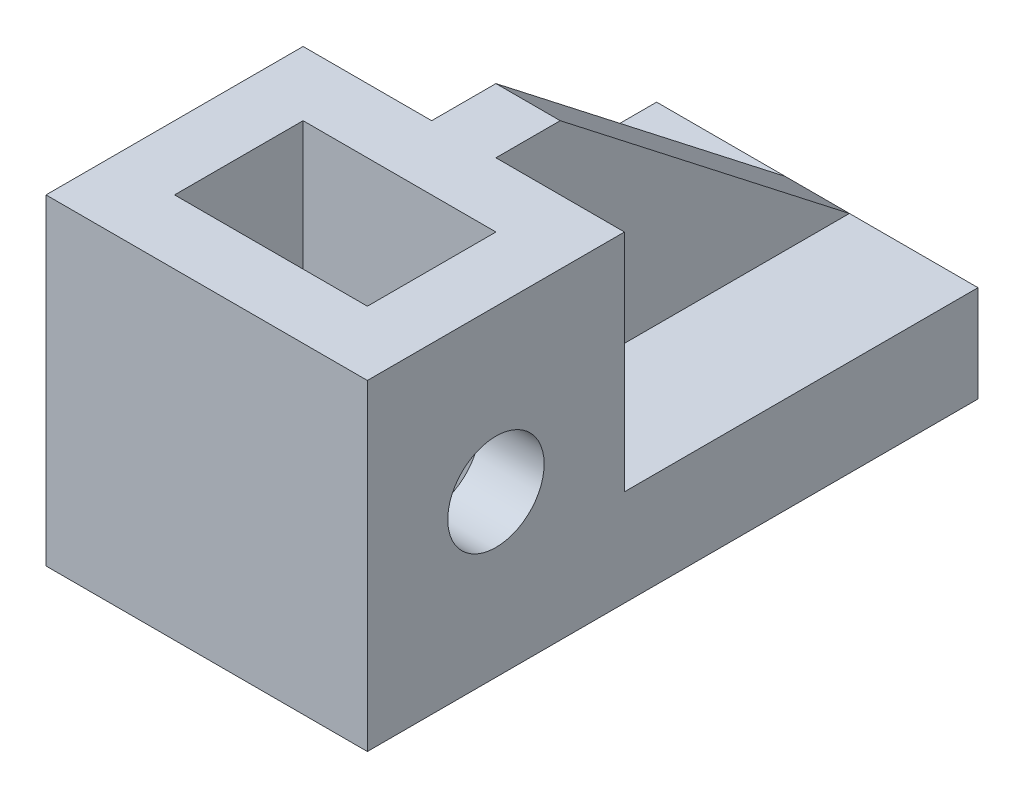
ISO-10303-21;
HEADER;
FILE_DESCRIPTION(('STEP AP214'),'2;1');
FILE_NAME('part.step','',(''),(''),'','','');
FILE_SCHEMA(('AUTOMOTIVE_DESIGN { 1 0 10303 214 1 1 1 1 }'));
ENDSEC;
DATA;
#1=APPLICATION_CONTEXT('core data for automotive mechanical design processes');
#2=APPLICATION_PROTOCOL_DEFINITION('international standard','automotive_design',2000,#1);
#3=PRODUCT_CONTEXT('',#1,'mechanical');
#4=PRODUCT('Part','Part','',(#3));
#5=PRODUCT_RELATED_PRODUCT_CATEGORY('part','',(#4));
#6=PRODUCT_DEFINITION_FORMATION('','',#4);
#7=PRODUCT_DEFINITION_CONTEXT('part definition',#1,'design');
#8=PRODUCT_DEFINITION('design','',#6,#7);
#9=PRODUCT_DEFINITION_SHAPE('','',#8);
#10=(LENGTH_UNIT() NAMED_UNIT(*) SI_UNIT(.MILLI.,.METRE.));
#11=(NAMED_UNIT(*) PLANE_ANGLE_UNIT() SI_UNIT($,.RADIAN.));
#12=(NAMED_UNIT(*) SI_UNIT($,.STERADIAN.) SOLID_ANGLE_UNIT());
#13=UNCERTAINTY_MEASURE_WITH_UNIT(LENGTH_MEASURE(1.E-05),#10,'distance_accuracy_value','');
#14=(GEOMETRIC_REPRESENTATION_CONTEXT(3) GLOBAL_UNCERTAINTY_ASSIGNED_CONTEXT((#13)) GLOBAL_UNIT_ASSIGNED_CONTEXT((#10,
#11,#12)) REPRESENTATION_CONTEXT('',''));
#15=CARTESIAN_POINT('',(0.,0.,0.));
#16=DIRECTION('',(0.,0.,1.));
#17=DIRECTION('',(1.,0.,0.));
#18=AXIS2_PLACEMENT_3D('',#15,#16,#17);
#19=CARTESIAN_POINT('',(-25.,15.,-95.));
#20=DIRECTION('',(0.,1.,0.));
#21=DIRECTION('',(0.,0.,1.));
#22=AXIS2_PLACEMENT_3D('',#19,#20,#21);
#23=PLANE('',#22);
#24=DIRECTION('',(0.,0.,1.));
#25=VECTOR('',#24,1.);
#26=CARTESIAN_POINT('',(-5.,15.,-95.));
#27=LINE('',#26,#25);
#28=CARTESIAN_POINT('',(-5.,15.,-95.));
#29=VERTEX_POINT('',#28);
#30=CARTESIAN_POINT('',(-5.,15.,-40.));
#31=VERTEX_POINT('',#30);
#32=EDGE_CURVE('E11',#29,#31,#27,.T.);
#33=ORIENTED_EDGE('',*,*,#32,.F.);
#34=DIRECTION('',(1.,0.,0.));
#35=VECTOR('',#34,1.);
#36=CARTESIAN_POINT('',(-25.,15.,-95.));
#37=LINE('',#36,#35);
#38=CARTESIAN_POINT('',(-25.,15.,-95.));
#39=VERTEX_POINT('',#38);
#40=EDGE_CURVE('E164',#39,#29,#37,.T.);
#41=ORIENTED_EDGE('',*,*,#40,.F.);
#42=DIRECTION('',(0.,0.,1.));
#43=VECTOR('',#42,1.);
#44=CARTESIAN_POINT('',(-25.,15.,-95.));
#45=LINE('',#44,#43);
#46=CARTESIAN_POINT('',(-25.,15.,-40.));
#47=VERTEX_POINT('',#46);
#48=EDGE_CURVE('E226',#39,#47,#45,.T.);
#49=ORIENTED_EDGE('',*,*,#48,.T.);
#50=DIRECTION('',(1.,0.,0.));
#51=VECTOR('',#50,1.);
#52=CARTESIAN_POINT('',(-25.,15.,-40.));
#53=LINE('',#52,#51);
#54=EDGE_CURVE('E253',#47,#31,#53,.T.);
#55=ORIENTED_EDGE('',*,*,#54,.T.);
#56=EDGE_LOOP('',(#33,#41,#49,#55));
#57=FACE_BOUND('',#56,.T.);
#58=ADVANCED_FACE('F37',(#57),#23,.T.);
#59=CARTESIAN_POINT('',(-25.,50.,-40.));
#60=DIRECTION('',(0.,0.,-1.));
#61=DIRECTION('',(0.,1.,0.));
#62=AXIS2_PLACEMENT_3D('',#59,#60,#61);
#63=PLANE('',#62);
#64=DIRECTION('',(0.,1.,0.));
#65=VECTOR('',#64,1.);
#66=CARTESIAN_POINT('',(-5.,9.99999999999998,-40.));
#67=LINE('',#66,#65);
#68=CARTESIAN_POINT('',(-5.,50.,-40.));
#69=VERTEX_POINT('',#68);
#70=EDGE_CURVE('E179',#31,#69,#67,.T.);
#71=ORIENTED_EDGE('',*,*,#70,.F.);
#72=ORIENTED_EDGE('',*,*,#54,.F.);
#73=DIRECTION('',(0.,1.,0.));
#74=VECTOR('',#73,1.);
#75=CARTESIAN_POINT('',(-25.,50.,-40.));
#76=LINE('',#75,#74);
#77=CARTESIAN_POINT('',(-25.,50.,-40.));
#78=VERTEX_POINT('',#77);
#79=EDGE_CURVE('E229',#47,#78,#76,.T.);
#80=ORIENTED_EDGE('',*,*,#79,.T.);
#81=DIRECTION('',(1.,0.,0.));
#82=VECTOR('',#81,1.);
#83=CARTESIAN_POINT('',(-25.,50.,-40.));
#84=LINE('',#83,#82);
#85=EDGE_CURVE('E60',#78,#69,#84,.T.);
#86=ORIENTED_EDGE('',*,*,#85,.T.);
#87=EDGE_LOOP('',(#71,#72,#80,#86));
#88=FACE_BOUND('',#87,.T.);
#89=ADVANCED_FACE('F309',(#88),#63,.T.);
#90=CARTESIAN_POINT('',(-25.,50.,0.));
#91=DIRECTION('',(0.,1.,0.));
#92=DIRECTION('',(0.,0.,1.));
#93=AXIS2_PLACEMENT_3D('',#90,#91,#92);
#94=PLANE('',#93);
#95=DIRECTION('',(-1.,0.,0.));
#96=VECTOR('',#95,1.);
#97=CARTESIAN_POINT('',(-25.,50.,-10.));
#98=LINE('',#97,#96);
#99=CARTESIAN_POINT('',(15.,50.,-10.));
#100=VERTEX_POINT('',#99);
#101=CARTESIAN_POINT('',(-15.,50.,-10.));
#102=VERTEX_POINT('',#101);
#103=EDGE_CURVE('E250',#100,#102,#98,.T.);
#104=ORIENTED_EDGE('',*,*,#103,.T.);
#105=DIRECTION('',(0.,0.,-1.));
#106=VECTOR('',#105,1.);
#107=CARTESIAN_POINT('',(-15.,50.,0.));
#108=LINE('',#107,#106);
#109=CARTESIAN_POINT('',(-15.,50.,-30.));
#110=VERTEX_POINT('',#109);
#111=EDGE_CURVE('E203',#102,#110,#108,.T.);
#112=ORIENTED_EDGE('',*,*,#111,.T.);
#113=DIRECTION('',(1.,0.,0.));
#114=VECTOR('',#113,1.);
#115=CARTESIAN_POINT('',(-25.,50.,-30.));
#116=LINE('',#115,#114);
#117=CARTESIAN_POINT('',(15.,50.,-30.));
#118=VERTEX_POINT('',#117);
#119=EDGE_CURVE('E144',#110,#118,#116,.T.);
#120=ORIENTED_EDGE('',*,*,#119,.T.);
#121=DIRECTION('',(0.,0.,1.));
#122=VECTOR('',#121,1.);
#123=CARTESIAN_POINT('',(15.,50.,0.));
#124=LINE('',#123,#122);
#125=EDGE_CURVE('E207',#118,#100,#124,.T.);
#126=ORIENTED_EDGE('',*,*,#125,.T.);
#127=EDGE_LOOP('',(#104,#112,#120,#126));
#128=FACE_BOUND('',#127,.T.);
#129=DIRECTION('',(1.,0.,0.));
#130=VECTOR('',#129,1.);
#131=CARTESIAN_POINT('',(-25.,50.,0.));
#132=LINE('',#131,#130);
#133=CARTESIAN_POINT('',(-25.,50.,0.));
#134=VERTEX_POINT('',#133);
#135=CARTESIAN_POINT('',(25.,50.,0.));
#136=VERTEX_POINT('',#135);
#137=EDGE_CURVE('E248',#134,#136,#132,.T.);
#138=ORIENTED_EDGE('',*,*,#137,.T.);
#139=DIRECTION('',(0.,0.,1.));
#140=VECTOR('',#139,1.);
#141=CARTESIAN_POINT('',(25.,50.,0.));
#142=LINE('',#141,#140);
#143=CARTESIAN_POINT('',(25.,50.,-40.));
#144=VERTEX_POINT('',#143);
#145=EDGE_CURVE('E221',#144,#136,#142,.T.);
#146=ORIENTED_EDGE('',*,*,#145,.F.);
#147=CARTESIAN_POINT('',(5.,50.,-40.));
#148=VERTEX_POINT('',#147);
#149=EDGE_CURVE('E252',#148,#144,#84,.T.);
#150=ORIENTED_EDGE('',*,*,#149,.F.);
#151=DIRECTION('',(0.,0.,-1.));
#152=VECTOR('',#151,1.);
#153=CARTESIAN_POINT('',(5.,50.,-50.));
#154=LINE('',#153,#152);
#155=CARTESIAN_POINT('',(5.,50.,-50.));
#156=VERTEX_POINT('',#155);
#157=EDGE_CURVE('E170',#148,#156,#154,.T.);
#158=ORIENTED_EDGE('',*,*,#157,.T.);
#159=DIRECTION('',(-1.,0.,0.));
#160=VECTOR('',#159,1.);
#161=CARTESIAN_POINT('',(-5.,50.,-50.));
#162=LINE('',#161,#160);
#163=CARTESIAN_POINT('',(-5.,50.,-50.));
#164=VERTEX_POINT('',#163);
#165=EDGE_CURVE('E152',#156,#164,#162,.T.);
#166=ORIENTED_EDGE('',*,*,#165,.T.);
#167=DIRECTION('',(0.,0.,1.));
#168=VECTOR('',#167,1.);
#169=CARTESIAN_POINT('',(-5.,50.,-40.));
#170=LINE('',#169,#168);
#171=EDGE_CURVE('E176',#164,#69,#170,.T.);
#172=ORIENTED_EDGE('',*,*,#171,.T.);
#173=ORIENTED_EDGE('',*,*,#85,.F.);
#174=DIRECTION('',(0.,0.,1.));
#175=VECTOR('',#174,1.);
#176=CARTESIAN_POINT('',(-25.,50.,0.));
#177=LINE('',#176,#175);
#178=EDGE_CURVE('E231',#78,#134,#177,.T.);
#179=ORIENTED_EDGE('',*,*,#178,.T.);
#180=EDGE_LOOP('',(#138,#146,#150,#158,#166,#172,#173,#179));
#181=FACE_BOUND('',#180,.T.);
#182=ADVANCED_FACE('F266',(#128,#181),#94,.T.);
#183=CARTESIAN_POINT('',(-25.,25.,-20.));
#184=DIRECTION('',(1.,0.,0.));
#185=DIRECTION('',(0.,0.,-1.));
#186=AXIS2_PLACEMENT_3D('',#183,#184,#185);
#187=CYLINDRICAL_SURFACE('',#186,7.5);
#188=CARTESIAN_POINT('',(25.,25.,-20.));
#189=DIRECTION('',(1.,0.,0.));
#190=DIRECTION('',(0.,0.,-1.));
#191=AXIS2_PLACEMENT_3D('',#188,#189,#190);
#192=CIRCLE('',#191,7.5);
#193=CARTESIAN_POINT('',(25.,25.,-27.5));
#194=VERTEX_POINT('',#193);
#195=EDGE_CURVE('E210',#194,#194,#192,.T.);
#196=ORIENTED_EDGE('',*,*,#195,.T.);
#197=EDGE_LOOP('',(#196));
#198=FACE_BOUND('',#197,.T.);
#199=CARTESIAN_POINT('',(15.,25.,-20.));
#200=DIRECTION('',(-1.,0.,0.));
#201=DIRECTION('',(0.,0.,1.));
#202=AXIS2_PLACEMENT_3D('',#199,#200,#201);
#203=CIRCLE('',#202,7.5);
#204=CARTESIAN_POINT('',(15.,25.,-12.5));
#205=VERTEX_POINT('',#204);
#206=EDGE_CURVE('E206',#205,#205,#203,.F.);
#207=ORIENTED_EDGE('',*,*,#206,.F.);
#208=EDGE_LOOP('',(#207));
#209=FACE_BOUND('',#208,.T.);
#210=ADVANCED_FACE('F295',(#198,#209),#187,.F.);
#211=CARTESIAN_POINT('',(-25.,25.,-20.));
#212=DIRECTION('',(1.,0.,0.));
#213=DIRECTION('',(0.,0.,-1.));
#214=AXIS2_PLACEMENT_3D('',#211,#212,#213);
#215=CIRCLE('',#214,7.5);
#216=CARTESIAN_POINT('',(-25.,25.,-27.5));
#217=VERTEX_POINT('',#216);
#218=EDGE_CURVE('E211',#217,#217,#215,.T.);
#219=ORIENTED_EDGE('',*,*,#218,.F.);
#220=EDGE_LOOP('',(#219));
#221=FACE_BOUND('',#220,.T.);
#222=CARTESIAN_POINT('',(-15.,25.,-20.));
#223=DIRECTION('',(1.,0.,0.));
#224=DIRECTION('',(0.,0.,-1.));
#225=AXIS2_PLACEMENT_3D('',#222,#223,#224);
#226=CIRCLE('',#225,7.5);
#227=CARTESIAN_POINT('',(-15.,25.,-27.5));
#228=VERTEX_POINT('',#227);
#229=EDGE_CURVE('E202',#228,#228,#226,.F.);
#230=ORIENTED_EDGE('',*,*,#229,.F.);
#231=EDGE_LOOP('',(#230));
#232=FACE_BOUND('',#231,.T.);
#233=ADVANCED_FACE('F293',(#221,#232),#187,.F.);
#234=CARTESIAN_POINT('',(-25.,50.,0.));
#235=DIRECTION('',(0.,0.,1.));
#236=DIRECTION('',(1.,0.,0.));
#237=AXIS2_PLACEMENT_3D('',#234,#235,#236);
#238=PLANE('',#237);
#239=DIRECTION('',(0.,-1.,0.));
#240=VECTOR('',#239,1.);
#241=CARTESIAN_POINT('',(25.,50.,0.));
#242=LINE('',#241,#240);
#243=CARTESIAN_POINT('',(25.,0.,0.));
#244=VERTEX_POINT('',#243);
#245=EDGE_CURVE('E214',#136,#244,#242,.T.);
#246=ORIENTED_EDGE('',*,*,#245,.F.);
#247=ORIENTED_EDGE('',*,*,#137,.F.);
#248=DIRECTION('',(0.,-1.,0.));
#249=VECTOR('',#248,1.);
#250=CARTESIAN_POINT('',(-25.,50.,0.));
#251=LINE('',#250,#249);
#252=CARTESIAN_POINT('',(-25.,0.,0.));
#253=VERTEX_POINT('',#252);
#254=EDGE_CURVE('E217',#134,#253,#251,.T.);
#255=ORIENTED_EDGE('',*,*,#254,.T.);
#256=DIRECTION('',(1.,0.,0.));
#257=VECTOR('',#256,1.);
#258=CARTESIAN_POINT('',(-25.,0.,0.));
#259=LINE('',#258,#257);
#260=EDGE_CURVE('E234',#253,#244,#259,.T.);
#261=ORIENTED_EDGE('',*,*,#260,.T.);
#262=EDGE_LOOP('',(#246,#247,#255,#261));
#263=FACE_BOUND('',#262,.T.);
#264=ADVANCED_FACE('F39',(#263),#238,.T.);
#265=DIRECTION('',(0.,1.,0.));
#266=VECTOR('',#265,1.);
#267=CARTESIAN_POINT('',(5.,9.99999999999998,-40.));
#268=LINE('',#267,#266);
#269=CARTESIAN_POINT('',(5.,15.,-40.));
#270=VERTEX_POINT('',#269);
#271=EDGE_CURVE('E52',#270,#148,#268,.T.);
#272=ORIENTED_EDGE('',*,*,#271,.T.);
#273=ORIENTED_EDGE('',*,*,#149,.T.);
#274=DIRECTION('',(0.,1.,0.));
#275=VECTOR('',#274,1.);
#276=CARTESIAN_POINT('',(25.,50.,-40.));
#277=LINE('',#276,#275);
#278=CARTESIAN_POINT('',(25.,15.,-40.));
#279=VERTEX_POINT('',#278);
#280=EDGE_CURVE('E243',#279,#144,#277,.T.);
#281=ORIENTED_EDGE('',*,*,#280,.F.);
#282=EDGE_CURVE('E255',#270,#279,#53,.T.);
#283=ORIENTED_EDGE('',*,*,#282,.F.);
#284=EDGE_LOOP('',(#272,#273,#281,#283));
#285=FACE_BOUND('',#284,.T.);
#286=ADVANCED_FACE('F302',(#285),#63,.T.);
#287=CARTESIAN_POINT('',(5.,15.,-95.));
#288=VERTEX_POINT('',#287);
#289=CARTESIAN_POINT('',(25.,15.,-95.));
#290=VERTEX_POINT('',#289);
#291=EDGE_CURVE('E157',#288,#290,#37,.T.);
#292=ORIENTED_EDGE('',*,*,#291,.F.);
#293=DIRECTION('',(0.,0.,-1.));
#294=VECTOR('',#293,1.);
#295=CARTESIAN_POINT('',(5.,15.,-95.));
#296=LINE('',#295,#294);
#297=EDGE_CURVE('E45',#270,#288,#296,.T.);
#298=ORIENTED_EDGE('',*,*,#297,.F.);
#299=ORIENTED_EDGE('',*,*,#282,.T.);
#300=DIRECTION('',(0.,0.,1.));
#301=VECTOR('',#300,1.);
#302=CARTESIAN_POINT('',(25.,15.,-95.));
#303=LINE('',#302,#301);
#304=EDGE_CURVE('E160',#290,#279,#303,.T.);
#305=ORIENTED_EDGE('',*,*,#304,.F.);
#306=EDGE_LOOP('',(#292,#298,#299,#305));
#307=FACE_BOUND('',#306,.T.);
#308=ADVANCED_FACE('F158',(#307),#23,.T.);
#309=CARTESIAN_POINT('',(-25.,0.,-95.));
#310=DIRECTION('',(0.,0.,-1.));
#311=DIRECTION('',(-1.,0.,0.));
#312=AXIS2_PLACEMENT_3D('',#309,#310,#311);
#313=PLANE('',#312);
#314=DIRECTION('',(0.,1.,0.));
#315=VECTOR('',#314,1.);
#316=CARTESIAN_POINT('',(25.,0.,-95.));
#317=LINE('',#316,#315);
#318=CARTESIAN_POINT('',(25.,0.,-95.));
#319=VERTEX_POINT('',#318);
#320=EDGE_CURVE('E240',#319,#290,#317,.T.);
#321=ORIENTED_EDGE('',*,*,#320,.F.);
#322=DIRECTION('',(1.,0.,0.));
#323=VECTOR('',#322,1.);
#324=CARTESIAN_POINT('',(-25.,0.,-95.));
#325=LINE('',#324,#323);
#326=CARTESIAN_POINT('',(-25.,0.,-95.));
#327=VERTEX_POINT('',#326);
#328=EDGE_CURVE('E165',#327,#319,#325,.T.);
#329=ORIENTED_EDGE('',*,*,#328,.F.);
#330=DIRECTION('',(0.,1.,0.));
#331=VECTOR('',#330,1.);
#332=CARTESIAN_POINT('',(-25.,0.,-95.));
#333=LINE('',#332,#331);
#334=EDGE_CURVE('E224',#327,#39,#333,.T.);
#335=ORIENTED_EDGE('',*,*,#334,.T.);
#336=ORIENTED_EDGE('',*,*,#40,.T.);
#337=DIRECTION('',(-1.,0.,0.));
#338=VECTOR('',#337,1.);
#339=CARTESIAN_POINT('',(-25.,15.,-95.));
#340=LINE('',#339,#338);
#341=EDGE_CURVE('E149',#29,#288,#340,.F.);
#342=ORIENTED_EDGE('',*,*,#341,.T.);
#343=ORIENTED_EDGE('',*,*,#291,.T.);
#344=EDGE_LOOP('',(#321,#329,#335,#336,#342,#343));
#345=FACE_BOUND('',#344,.T.);
#346=ADVANCED_FACE('F168',(#345),#313,.T.);
#347=CARTESIAN_POINT('',(-25.,0.,0.));
#348=DIRECTION('',(0.,-1.,0.));
#349=DIRECTION('',(0.,0.,-1.));
#350=AXIS2_PLACEMENT_3D('',#347,#348,#349);
#351=PLANE('',#350);
#352=DIRECTION('',(0.,0.,-1.));
#353=VECTOR('',#352,1.);
#354=CARTESIAN_POINT('',(25.,0.,0.));
#355=LINE('',#354,#353);
#356=EDGE_CURVE('E237',#244,#319,#355,.T.);
#357=ORIENTED_EDGE('',*,*,#356,.F.);
#358=ORIENTED_EDGE('',*,*,#260,.F.);
#359=DIRECTION('',(0.,0.,-1.));
#360=VECTOR('',#359,1.);
#361=CARTESIAN_POINT('',(-25.,0.,0.));
#362=LINE('',#361,#360);
#363=EDGE_CURVE('E220',#253,#327,#362,.T.);
#364=ORIENTED_EDGE('',*,*,#363,.T.);
#365=ORIENTED_EDGE('',*,*,#328,.T.);
#366=EDGE_LOOP('',(#357,#358,#364,#365));
#367=FACE_BOUND('',#366,.T.);
#368=ADVANCED_FACE('F322',(#367),#351,.T.);
#369=CARTESIAN_POINT('',(-25.,0.,0.));
#370=DIRECTION('',(1.,0.,0.));
#371=DIRECTION('',(0.,0.,-1.));
#372=AXIS2_PLACEMENT_3D('',#369,#370,#371);
#373=PLANE('',#372);
#374=ORIENTED_EDGE('',*,*,#218,.T.);
#375=EDGE_LOOP('',(#374));
#376=FACE_BOUND('',#375,.T.);
#377=ORIENTED_EDGE('',*,*,#254,.F.);
#378=ORIENTED_EDGE('',*,*,#178,.F.);
#379=ORIENTED_EDGE('',*,*,#79,.F.);
#380=ORIENTED_EDGE('',*,*,#48,.F.);
#381=ORIENTED_EDGE('',*,*,#334,.F.);
#382=ORIENTED_EDGE('',*,*,#363,.F.);
#383=EDGE_LOOP('',(#377,#378,#379,#380,#381,#382));
#384=FACE_BOUND('',#383,.T.);
#385=ADVANCED_FACE('F330',(#376,#384),#373,.F.);
#386=CARTESIAN_POINT('',(25.,0.,0.));
#387=DIRECTION('',(1.,0.,0.));
#388=DIRECTION('',(0.,0.,-1.));
#389=AXIS2_PLACEMENT_3D('',#386,#387,#388);
#390=PLANE('',#389);
#391=ORIENTED_EDGE('',*,*,#195,.F.);
#392=EDGE_LOOP('',(#391));
#393=FACE_BOUND('',#392,.T.);
#394=ORIENTED_EDGE('',*,*,#245,.T.);
#395=ORIENTED_EDGE('',*,*,#356,.T.);
#396=ORIENTED_EDGE('',*,*,#320,.T.);
#397=ORIENTED_EDGE('',*,*,#304,.T.);
#398=ORIENTED_EDGE('',*,*,#280,.T.);
#399=ORIENTED_EDGE('',*,*,#145,.T.);
#400=EDGE_LOOP('',(#394,#395,#396,#397,#398,#399));
#401=FACE_BOUND('',#400,.T.);
#402=ADVANCED_FACE('F328',(#393,#401),#390,.T.);
#403=CARTESIAN_POINT('',(15.,50.000012,-30.));
#404=DIRECTION('',(-1.,0.,0.));
#405=DIRECTION('',(0.,0.,1.));
#406=AXIS2_PLACEMENT_3D('',#403,#404,#405);
#407=PLANE('',#406);
#408=DIRECTION('',(0.,-1.,0.));
#409=VECTOR('',#408,1.);
#410=CARTESIAN_POINT('',(15.,50.000012,-30.));
#411=LINE('',#410,#409);
#412=CARTESIAN_POINT('',(15.,10.,-30.));
#413=VERTEX_POINT('',#412);
#414=EDGE_CURVE('E200',#118,#413,#411,.T.);
#415=ORIENTED_EDGE('',*,*,#414,.T.);
#416=DIRECTION('',(0.,0.,-1.));
#417=VECTOR('',#416,1.);
#418=CARTESIAN_POINT('',(15.,10.,-30.));
#419=LINE('',#418,#417);
#420=CARTESIAN_POINT('',(15.,10.,-10.));
#421=VERTEX_POINT('',#420);
#422=EDGE_CURVE('E181',#421,#413,#419,.T.);
#423=ORIENTED_EDGE('',*,*,#422,.F.);
#424=DIRECTION('',(0.,-1.,0.));
#425=VECTOR('',#424,1.);
#426=CARTESIAN_POINT('',(15.,50.000012,-10.));
#427=LINE('',#426,#425);
#428=EDGE_CURVE('E192',#100,#421,#427,.T.);
#429=ORIENTED_EDGE('',*,*,#428,.F.);
#430=ORIENTED_EDGE('',*,*,#125,.F.);
#431=EDGE_LOOP('',(#415,#423,#429,#430));
#432=FACE_BOUND('',#431,.T.);
#433=ORIENTED_EDGE('',*,*,#206,.T.);
#434=EDGE_LOOP('',(#433));
#435=FACE_BOUND('',#434,.T.);
#436=ADVANCED_FACE('F274',(#432,#435),#407,.T.);
#437=CARTESIAN_POINT('',(-15.,50.000012,-30.));
#438=DIRECTION('',(1.,0.,0.));
#439=DIRECTION('',(0.,0.,-1.));
#440=AXIS2_PLACEMENT_3D('',#437,#438,#439);
#441=PLANE('',#440);
#442=DIRECTION('',(0.,-1.,0.));
#443=VECTOR('',#442,1.);
#444=CARTESIAN_POINT('',(-15.,50.000012,-10.));
#445=LINE('',#444,#443);
#446=CARTESIAN_POINT('',(-15.,10.,-10.));
#447=VERTEX_POINT('',#446);
#448=EDGE_CURVE('E195',#102,#447,#445,.T.);
#449=ORIENTED_EDGE('',*,*,#448,.T.);
#450=DIRECTION('',(0.,0.,1.));
#451=VECTOR('',#450,1.);
#452=CARTESIAN_POINT('',(-15.,10.,-30.));
#453=LINE('',#452,#451);
#454=CARTESIAN_POINT('',(-15.,10.,-30.));
#455=VERTEX_POINT('',#454);
#456=EDGE_CURVE('E187',#455,#447,#453,.T.);
#457=ORIENTED_EDGE('',*,*,#456,.F.);
#458=DIRECTION('',(0.,-1.,0.));
#459=VECTOR('',#458,1.);
#460=CARTESIAN_POINT('',(-15.,50.000012,-30.));
#461=LINE('',#460,#459);
#462=EDGE_CURVE('E197',#110,#455,#461,.T.);
#463=ORIENTED_EDGE('',*,*,#462,.F.);
#464=ORIENTED_EDGE('',*,*,#111,.F.);
#465=EDGE_LOOP('',(#449,#457,#463,#464));
#466=FACE_BOUND('',#465,.T.);
#467=ORIENTED_EDGE('',*,*,#229,.T.);
#468=EDGE_LOOP('',(#467));
#469=FACE_BOUND('',#468,.T.);
#470=ADVANCED_FACE('F287',(#466,#469),#441,.T.);
#471=CARTESIAN_POINT('',(-15.,50.000012,-30.));
#472=DIRECTION('',(0.,0.,1.));
#473=DIRECTION('',(1.,0.,0.));
#474=AXIS2_PLACEMENT_3D('',#471,#472,#473);
#475=PLANE('',#474);
#476=ORIENTED_EDGE('',*,*,#414,.F.);
#477=ORIENTED_EDGE('',*,*,#119,.F.);
#478=ORIENTED_EDGE('',*,*,#462,.T.);
#479=DIRECTION('',(-1.,0.,0.));
#480=VECTOR('',#479,1.);
#481=CARTESIAN_POINT('',(-15.,10.,-30.));
#482=LINE('',#481,#480);
#483=EDGE_CURVE('E185',#413,#455,#482,.T.);
#484=ORIENTED_EDGE('',*,*,#483,.F.);
#485=EDGE_LOOP('',(#476,#477,#478,#484));
#486=FACE_BOUND('',#485,.T.);
#487=ADVANCED_FACE('F278',(#486),#475,.T.);
#488=CARTESIAN_POINT('',(-15.,50.000012,-10.));
#489=DIRECTION('',(0.,0.,-1.));
#490=DIRECTION('',(-1.,0.,0.));
#491=AXIS2_PLACEMENT_3D('',#488,#489,#490);
#492=PLANE('',#491);
#493=ORIENTED_EDGE('',*,*,#428,.T.);
#494=DIRECTION('',(1.,0.,0.));
#495=VECTOR('',#494,1.);
#496=CARTESIAN_POINT('',(-15.,10.,-10.));
#497=LINE('',#496,#495);
#498=EDGE_CURVE('E190',#447,#421,#497,.T.);
#499=ORIENTED_EDGE('',*,*,#498,.F.);
#500=ORIENTED_EDGE('',*,*,#448,.F.);
#501=ORIENTED_EDGE('',*,*,#103,.F.);
#502=EDGE_LOOP('',(#493,#499,#500,#501));
#503=FACE_BOUND('',#502,.T.);
#504=ADVANCED_FACE('F285',(#503),#492,.T.);
#505=CARTESIAN_POINT('',(0.,10.,0.));
#506=DIRECTION('',(0.,1.,0.));
#507=DIRECTION('',(0.,0.,1.));
#508=AXIS2_PLACEMENT_3D('',#505,#506,#507);
#509=PLANE('',#508);
#510=ORIENTED_EDGE('',*,*,#483,.T.);
#511=ORIENTED_EDGE('',*,*,#456,.T.);
#512=ORIENTED_EDGE('',*,*,#498,.T.);
#513=ORIENTED_EDGE('',*,*,#422,.T.);
#514=EDGE_LOOP('',(#510,#511,#512,#513));
#515=FACE_BOUND('',#514,.T.);
#516=ADVANCED_FACE('F281',(#515),#509,.T.);
#517=CARTESIAN_POINT('',(-5.,9.99999999999998,-40.));
#518=DIRECTION('',(-1.,0.,0.));
#519=DIRECTION('',(0.,0.,1.));
#520=AXIS2_PLACEMENT_3D('',#517,#518,#519);
#521=PLANE('',#520);
#522=ORIENTED_EDGE('',*,*,#171,.F.);
#523=DIRECTION('',(0.,-0.613940613514921,-0.789352217376326));
#524=VECTOR('',#523,1.);
#525=CARTESIAN_POINT('',(-5.,50.,-50.));
#526=LINE('',#525,#524);
#527=EDGE_CURVE('E154',#164,#29,#526,.T.);
#528=ORIENTED_EDGE('',*,*,#527,.T.);
#529=ORIENTED_EDGE('',*,*,#32,.T.);
#530=ORIENTED_EDGE('',*,*,#70,.T.);
#531=EDGE_LOOP('',(#522,#528,#529,#530));
#532=FACE_BOUND('',#531,.T.);
#533=ADVANCED_FACE('F349',(#532),#521,.T.);
#534=CARTESIAN_POINT('',(5.,9.99999999999998,-50.));
#535=DIRECTION('',(1.,0.,0.));
#536=DIRECTION('',(0.,0.,-1.));
#537=AXIS2_PLACEMENT_3D('',#534,#535,#536);
#538=PLANE('',#537);
#539=ORIENTED_EDGE('',*,*,#271,.F.);
#540=ORIENTED_EDGE('',*,*,#297,.T.);
#541=DIRECTION('',(0.,-0.613940613514921,-0.789352217376326));
#542=VECTOR('',#541,1.);
#543=CARTESIAN_POINT('',(5.,50.,-50.));
#544=LINE('',#543,#542);
#545=EDGE_CURVE('E140',#156,#288,#544,.T.);
#546=ORIENTED_EDGE('',*,*,#545,.F.);
#547=ORIENTED_EDGE('',*,*,#157,.F.);
#548=EDGE_LOOP('',(#539,#540,#546,#547));
#549=FACE_BOUND('',#548,.T.);
#550=ADVANCED_FACE('F138',(#549),#538,.T.);
#551=CARTESIAN_POINT('',(0.,50.,-50.));
#552=DIRECTION('',(0.,-0.789352217376326,0.613940613514921));
#553=DIRECTION('',(0.,-0.613940613514921,-0.789352217376326));
#554=AXIS2_PLACEMENT_3D('',#551,#552,#553);
#555=PLANE('',#554);
#556=ORIENTED_EDGE('',*,*,#341,.F.);
#557=ORIENTED_EDGE('',*,*,#527,.F.);
#558=ORIENTED_EDGE('',*,*,#165,.F.);
#559=ORIENTED_EDGE('',*,*,#545,.T.);
#560=EDGE_LOOP('',(#556,#557,#558,#559));
#561=FACE_BOUND('',#560,.T.);
#562=ADVANCED_FACE('F147',(#561),#555,.F.);
#563=CLOSED_SHELL('',(#58,#89,#182,#210,#233,#264,#286,#308,#346,#368,#385,#402,#436,#470,#487,
#504,#516,#533,#550,#562));
#564=MANIFOLD_SOLID_BREP('B2',#563);
#565=ADVANCED_BREP_SHAPE_REPRESENTATION('',(#18,#564),#14);
#566=SHAPE_DEFINITION_REPRESENTATION(#9,#565);
ENDSEC;
END-ISO-10303-21;
